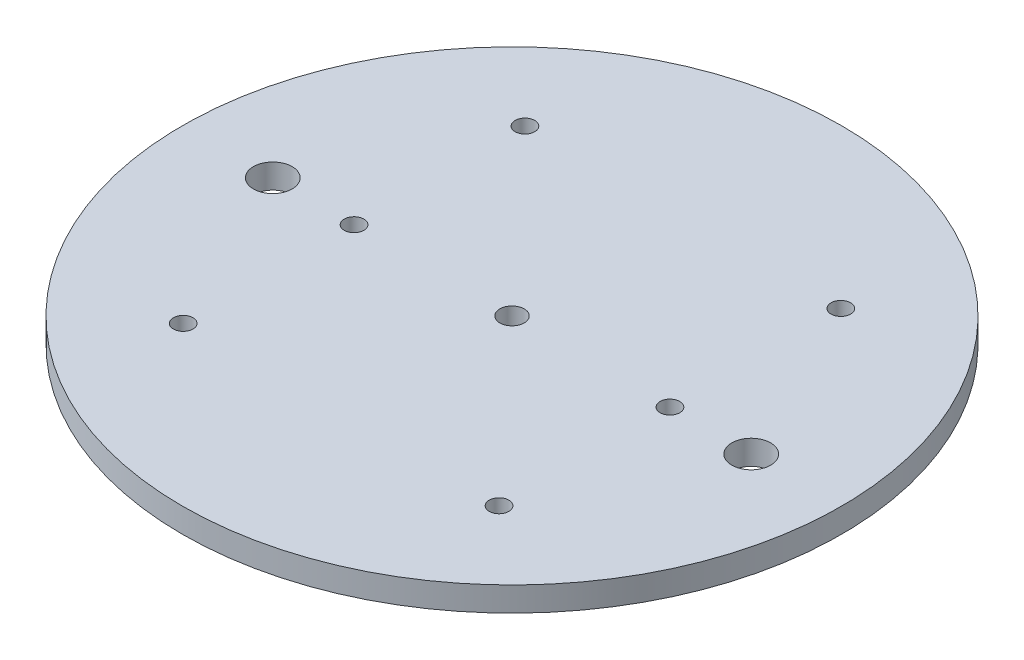
ISO-10303-21;
HEADER;
FILE_DESCRIPTION(('STEP AP214'),'2;1');
FILE_NAME('part.step','',(''),(''),'','','');
FILE_SCHEMA(('AUTOMOTIVE_DESIGN { 1 0 10303 214 1 1 1 1 }'));
ENDSEC;
DATA;
#1=APPLICATION_CONTEXT('core data for automotive mechanical design processes');
#2=APPLICATION_PROTOCOL_DEFINITION('international standard','automotive_design',2000,#1);
#3=PRODUCT_CONTEXT('',#1,'mechanical');
#4=PRODUCT('Part','Part','',(#3));
#5=PRODUCT_RELATED_PRODUCT_CATEGORY('part','',(#4));
#6=PRODUCT_DEFINITION_FORMATION('','',#4);
#7=PRODUCT_DEFINITION_CONTEXT('part definition',#1,'design');
#8=PRODUCT_DEFINITION('design','',#6,#7);
#9=PRODUCT_DEFINITION_SHAPE('','',#8);
#10=(LENGTH_UNIT() NAMED_UNIT(*) SI_UNIT(.MILLI.,.METRE.));
#11=(NAMED_UNIT(*) PLANE_ANGLE_UNIT() SI_UNIT($,.RADIAN.));
#12=(NAMED_UNIT(*) SI_UNIT($,.STERADIAN.) SOLID_ANGLE_UNIT());
#13=UNCERTAINTY_MEASURE_WITH_UNIT(LENGTH_MEASURE(1.E-05),#10,'distance_accuracy_value','');
#14=(GEOMETRIC_REPRESENTATION_CONTEXT(3) GLOBAL_UNCERTAINTY_ASSIGNED_CONTEXT((#13)) GLOBAL_UNIT_ASSIGNED_CONTEXT((#10,
#11,#12)) REPRESENTATION_CONTEXT('',''));
#15=CARTESIAN_POINT('',(0.,0.,0.));
#16=DIRECTION('',(0.,0.,1.));
#17=DIRECTION('',(1.,0.,0.));
#18=AXIS2_PLACEMENT_3D('',#15,#16,#17);
#19=CARTESIAN_POINT('',(0.,0.,0.));
#20=DIRECTION('',(0.,1.,0.));
#21=DIRECTION('',(0.,0.,1.));
#22=AXIS2_PLACEMENT_3D('',#19,#20,#21);
#23=PLANE('',#22);
#24=CARTESIAN_POINT('',(41.0845,1.1476392716558E-13,0.));
#25=DIRECTION('',(0.,-1.,0.));
#26=DIRECTION('',(0.,0.,-1.));
#27=AXIS2_PLACEMENT_3D('',#24,#25,#26);
#28=CIRCLE('',#27,2.5527);
#29=CARTESIAN_POINT('',(41.0845,1.1476392716558E-13,-2.55270000000005));
#30=VERTEX_POINT('',#29);
#31=EDGE_CURVE('E96',#30,#30,#28,.T.);
#32=ORIENTED_EDGE('',*,*,#31,.F.);
#33=EDGE_LOOP('',(#32));
#34=FACE_BOUND('',#33,.T.);
#35=CARTESIAN_POINT('',(41.0845,1.1476392716558E-13,-44.45));
#36=DIRECTION('',(0.,-1.,0.));
#37=DIRECTION('',(0.,0.,-1.));
#38=AXIS2_PLACEMENT_3D('',#35,#36,#37);
#39=CIRCLE('',#38,2.5527);
#40=CARTESIAN_POINT('',(41.0845,1.1476392716558E-13,-47.0027));
#41=VERTEX_POINT('',#40);
#42=EDGE_CURVE('E90',#41,#41,#39,.T.);
#43=ORIENTED_EDGE('',*,*,#42,.F.);
#44=EDGE_LOOP('',(#43));
#45=FACE_BOUND('',#44,.T.);
#46=CARTESIAN_POINT('',(-41.0845,1.1476392716558E-13,44.45));
#47=DIRECTION('',(0.,-1.,0.));
#48=DIRECTION('',(0.,0.,-1.));
#49=AXIS2_PLACEMENT_3D('',#46,#47,#48);
#50=CIRCLE('',#49,2.5527);
#51=CARTESIAN_POINT('',(-41.0845,1.1476392716558E-13,41.8973));
#52=VERTEX_POINT('',#51);
#53=EDGE_CURVE('E72',#52,#52,#50,.T.);
#54=ORIENTED_EDGE('',*,*,#53,.F.);
#55=EDGE_LOOP('',(#54));
#56=FACE_BOUND('',#55,.T.);
#57=CARTESIAN_POINT('',(41.0845,1.1476392716558E-13,44.45));
#58=DIRECTION('',(0.,-1.,0.));
#59=DIRECTION('',(0.,0.,-1.));
#60=AXIS2_PLACEMENT_3D('',#57,#58,#59);
#61=CIRCLE('',#60,2.5527);
#62=CARTESIAN_POINT('',(41.0845,1.1476392716558E-13,41.8973));
#63=VERTEX_POINT('',#62);
#64=EDGE_CURVE('E66',#63,#63,#61,.T.);
#65=ORIENTED_EDGE('',*,*,#64,.F.);
#66=EDGE_LOOP('',(#65));
#67=FACE_BOUND('',#66,.T.);
#68=CARTESIAN_POINT('',(0.,0.,0.));
#69=DIRECTION('',(0.,1.,0.));
#70=DIRECTION('',(0.,0.,1.));
#71=AXIS2_PLACEMENT_3D('',#68,#69,#70);
#72=CIRCLE('',#71,3.17499999999999);
#73=CARTESIAN_POINT('',(0.,0.,3.17499999999999));
#74=VERTEX_POINT('',#73);
#75=EDGE_CURVE('E57',#74,#74,#72,.T.);
#76=ORIENTED_EDGE('',*,*,#75,.T.);
#77=EDGE_LOOP('',(#76));
#78=FACE_BOUND('',#77,.T.);
#79=CARTESIAN_POINT('',(-62.23,0.,0.));
#80=DIRECTION('',(0.,1.,0.));
#81=DIRECTION('',(0.,0.,1.));
#82=AXIS2_PLACEMENT_3D('',#79,#80,#81);
#83=CIRCLE('',#82,5.04189999999999);
#84=CARTESIAN_POINT('',(-62.23,0.,5.04189999999998));
#85=VERTEX_POINT('',#84);
#86=EDGE_CURVE('E51',#85,#85,#83,.T.);
#87=ORIENTED_EDGE('',*,*,#86,.T.);
#88=EDGE_LOOP('',(#87));
#89=FACE_BOUND('',#88,.T.);
#90=CARTESIAN_POINT('',(62.23,0.,0.));
#91=DIRECTION('',(0.,1.,0.));
#92=DIRECTION('',(0.,0.,1.));
#93=AXIS2_PLACEMENT_3D('',#90,#91,#92);
#94=CIRCLE('',#93,5.04189999999999);
#95=CARTESIAN_POINT('',(62.23,0.,5.0419));
#96=VERTEX_POINT('',#95);
#97=EDGE_CURVE('E44',#96,#96,#94,.T.);
#98=ORIENTED_EDGE('',*,*,#97,.T.);
#99=EDGE_LOOP('',(#98));
#100=FACE_BOUND('',#99,.T.);
#101=CARTESIAN_POINT('',(0.,0.,0.));
#102=DIRECTION('',(0.,1.,0.));
#103=DIRECTION('',(0.,0.,1.));
#104=AXIS2_PLACEMENT_3D('',#101,#102,#103);
#105=CIRCLE('',#104,85.725);
#106=CARTESIAN_POINT('',(0.,0.,85.725));
#107=VERTEX_POINT('',#106);
#108=EDGE_CURVE('E37',#107,#107,#105,.T.);
#109=ORIENTED_EDGE('',*,*,#108,.F.);
#110=EDGE_LOOP('',(#109));
#111=FACE_BOUND('',#110,.T.);
#112=CARTESIAN_POINT('',(-41.0845,1.1476392716558E-13,0.));
#113=DIRECTION('',(0.,-1.,0.));
#114=DIRECTION('',(0.,0.,-1.));
#115=AXIS2_PLACEMENT_3D('',#112,#113,#114);
#116=CIRCLE('',#115,2.5527);
#117=CARTESIAN_POINT('',(-41.0845,1.1476392716558E-13,-2.55270000000005));
#118=VERTEX_POINT('',#117);
#119=EDGE_CURVE('E78',#118,#118,#116,.T.);
#120=ORIENTED_EDGE('',*,*,#119,.F.);
#121=EDGE_LOOP('',(#120));
#122=FACE_BOUND('',#121,.T.);
#123=CARTESIAN_POINT('',(-41.0845,1.1476392716558E-13,-44.45));
#124=DIRECTION('',(0.,-1.,0.));
#125=DIRECTION('',(0.,0.,-1.));
#126=AXIS2_PLACEMENT_3D('',#123,#124,#125);
#127=CIRCLE('',#126,2.5527);
#128=CARTESIAN_POINT('',(-41.0845,1.1476392716558E-13,-47.0027));
#129=VERTEX_POINT('',#128);
#130=EDGE_CURVE('E84',#129,#129,#127,.T.);
#131=ORIENTED_EDGE('',*,*,#130,.F.);
#132=EDGE_LOOP('',(#131));
#133=FACE_BOUND('',#132,.T.);
#134=ADVANCED_FACE('F33',(#34,#45,#56,#67,#78,#89,#100,#111,#122,#133),#23,.F.);
#135=CARTESIAN_POINT('',(0.,6.35,0.));
#136=DIRECTION('',(0.,-1.,0.));
#137=DIRECTION('',(0.,0.,-1.));
#138=AXIS2_PLACEMENT_3D('',#135,#136,#137);
#139=CYLINDRICAL_SURFACE('',#138,85.725);
#140=CARTESIAN_POINT('',(0.,6.35,0.));
#141=DIRECTION('',(0.,1.,0.));
#142=DIRECTION('',(0.,0.,1.));
#143=AXIS2_PLACEMENT_3D('',#140,#141,#142);
#144=CIRCLE('',#143,85.725);
#145=CARTESIAN_POINT('',(0.,6.35,85.725));
#146=VERTEX_POINT('',#145);
#147=EDGE_CURVE('E10',#146,#146,#144,.T.);
#148=ORIENTED_EDGE('',*,*,#147,.F.);
#149=EDGE_LOOP('',(#148));
#150=FACE_BOUND('',#149,.T.);
#151=ORIENTED_EDGE('',*,*,#108,.T.);
#152=EDGE_LOOP('',(#151));
#153=FACE_BOUND('',#152,.T.);
#154=ADVANCED_FACE('F35',(#150,#153),#139,.T.);
#155=CARTESIAN_POINT('',(0.,6.35,0.));
#156=DIRECTION('',(0.,1.,0.));
#157=DIRECTION('',(0.,0.,1.));
#158=AXIS2_PLACEMENT_3D('',#155,#156,#157);
#159=PLANE('',#158);
#160=CARTESIAN_POINT('',(41.0845,6.35,0.));
#161=DIRECTION('',(0.,1.,0.));
#162=DIRECTION('',(0.,0.,1.));
#163=AXIS2_PLACEMENT_3D('',#160,#161,#162);
#164=CIRCLE('',#163,2.5527);
#165=CARTESIAN_POINT('',(41.0845,6.35,2.55269999999994));
#166=VERTEX_POINT('',#165);
#167=EDGE_CURVE('E93',#166,#166,#164,.T.);
#168=ORIENTED_EDGE('',*,*,#167,.F.);
#169=EDGE_LOOP('',(#168));
#170=FACE_BOUND('',#169,.T.);
#171=CARTESIAN_POINT('',(41.0845,6.35,-44.45));
#172=DIRECTION('',(0.,1.,0.));
#173=DIRECTION('',(0.,0.,1.));
#174=AXIS2_PLACEMENT_3D('',#171,#172,#173);
#175=CIRCLE('',#174,2.5527);
#176=CARTESIAN_POINT('',(41.0845,6.35,-41.8973));
#177=VERTEX_POINT('',#176);
#178=EDGE_CURVE('E87',#177,#177,#175,.T.);
#179=ORIENTED_EDGE('',*,*,#178,.F.);
#180=EDGE_LOOP('',(#179));
#181=FACE_BOUND('',#180,.T.);
#182=CARTESIAN_POINT('',(-41.0845,6.35,-44.45));
#183=DIRECTION('',(0.,1.,0.));
#184=DIRECTION('',(0.,0.,1.));
#185=AXIS2_PLACEMENT_3D('',#182,#183,#184);
#186=CIRCLE('',#185,2.5527);
#187=CARTESIAN_POINT('',(-41.0845,6.35,-41.8973));
#188=VERTEX_POINT('',#187);
#189=EDGE_CURVE('E81',#188,#188,#186,.T.);
#190=ORIENTED_EDGE('',*,*,#189,.F.);
#191=EDGE_LOOP('',(#190));
#192=FACE_BOUND('',#191,.T.);
#193=CARTESIAN_POINT('',(-41.0845,6.35,0.));
#194=DIRECTION('',(0.,1.,0.));
#195=DIRECTION('',(0.,0.,1.));
#196=AXIS2_PLACEMENT_3D('',#193,#194,#195);
#197=CIRCLE('',#196,2.5527);
#198=CARTESIAN_POINT('',(-41.0845,6.35,2.55269999999994));
#199=VERTEX_POINT('',#198);
#200=EDGE_CURVE('E75',#199,#199,#197,.T.);
#201=ORIENTED_EDGE('',*,*,#200,.F.);
#202=EDGE_LOOP('',(#201));
#203=FACE_BOUND('',#202,.T.);
#204=CARTESIAN_POINT('',(-41.0845,6.35,44.45));
#205=DIRECTION('',(0.,1.,0.));
#206=DIRECTION('',(0.,0.,1.));
#207=AXIS2_PLACEMENT_3D('',#204,#205,#206);
#208=CIRCLE('',#207,2.5527);
#209=CARTESIAN_POINT('',(-41.0845,6.35,47.0027));
#210=VERTEX_POINT('',#209);
#211=EDGE_CURVE('E69',#210,#210,#208,.T.);
#212=ORIENTED_EDGE('',*,*,#211,.F.);
#213=EDGE_LOOP('',(#212));
#214=FACE_BOUND('',#213,.T.);
#215=CARTESIAN_POINT('',(41.0845,6.35,44.45));
#216=DIRECTION('',(0.,1.,0.));
#217=DIRECTION('',(0.,0.,1.));
#218=AXIS2_PLACEMENT_3D('',#215,#216,#217);
#219=CIRCLE('',#218,2.5527);
#220=CARTESIAN_POINT('',(41.0845,6.35,47.0027));
#221=VERTEX_POINT('',#220);
#222=EDGE_CURVE('E63',#221,#221,#219,.T.);
#223=ORIENTED_EDGE('',*,*,#222,.F.);
#224=EDGE_LOOP('',(#223));
#225=FACE_BOUND('',#224,.T.);
#226=CARTESIAN_POINT('',(0.,6.35000000000012,0.));
#227=DIRECTION('',(0.,1.,0.));
#228=DIRECTION('',(0.,0.,1.));
#229=AXIS2_PLACEMENT_3D('',#226,#227,#228);
#230=CIRCLE('',#229,3.17499999999999);
#231=CARTESIAN_POINT('',(0.,6.35000000000012,3.17499999999999));
#232=VERTEX_POINT('',#231);
#233=EDGE_CURVE('E60',#232,#232,#230,.T.);
#234=ORIENTED_EDGE('',*,*,#233,.F.);
#235=EDGE_LOOP('',(#234));
#236=FACE_BOUND('',#235,.T.);
#237=CARTESIAN_POINT('',(-62.23,6.35,0.));
#238=DIRECTION('',(0.,1.,0.));
#239=DIRECTION('',(0.,0.,1.));
#240=AXIS2_PLACEMENT_3D('',#237,#238,#239);
#241=CIRCLE('',#240,5.04189999999999);
#242=CARTESIAN_POINT('',(-62.23,6.35,5.04189999999998));
#243=VERTEX_POINT('',#242);
#244=EDGE_CURVE('E54',#243,#243,#241,.T.);
#245=ORIENTED_EDGE('',*,*,#244,.F.);
#246=EDGE_LOOP('',(#245));
#247=FACE_BOUND('',#246,.T.);
#248=CARTESIAN_POINT('',(62.23,6.35,0.));
#249=DIRECTION('',(0.,1.,0.));
#250=DIRECTION('',(0.,0.,1.));
#251=AXIS2_PLACEMENT_3D('',#248,#249,#250);
#252=CIRCLE('',#251,5.04189999999999);
#253=CARTESIAN_POINT('',(62.23,6.35,5.0419));
#254=VERTEX_POINT('',#253);
#255=EDGE_CURVE('E48',#254,#254,#252,.T.);
#256=ORIENTED_EDGE('',*,*,#255,.F.);
#257=EDGE_LOOP('',(#256));
#258=FACE_BOUND('',#257,.T.);
#259=ORIENTED_EDGE('',*,*,#147,.T.);
#260=EDGE_LOOP('',(#259));
#261=FACE_BOUND('',#260,.T.);
#262=ADVANCED_FACE('F131',(#170,#181,#192,#203,#214,#225,#236,#247,#258,#261),#159,.T.);
#263=CARTESIAN_POINT('',(62.23,6.35,0.));
#264=DIRECTION('',(0.,1.,0.));
#265=DIRECTION('',(0.,0.,1.));
#266=AXIS2_PLACEMENT_3D('',#263,#264,#265);
#267=CYLINDRICAL_SURFACE('',#266,5.04189999999999);
#268=ORIENTED_EDGE('',*,*,#97,.F.);
#269=EDGE_LOOP('',(#268));
#270=FACE_BOUND('',#269,.T.);
#271=ORIENTED_EDGE('',*,*,#255,.T.);
#272=EDGE_LOOP('',(#271));
#273=FACE_BOUND('',#272,.T.);
#274=ADVANCED_FACE('F134',(#270,#273),#267,.F.);
#275=CARTESIAN_POINT('',(-62.23,6.35,0.));
#276=DIRECTION('',(0.,1.,0.));
#277=DIRECTION('',(0.,0.,1.));
#278=AXIS2_PLACEMENT_3D('',#275,#276,#277);
#279=CYLINDRICAL_SURFACE('',#278,5.04189999999999);
#280=ORIENTED_EDGE('',*,*,#86,.F.);
#281=EDGE_LOOP('',(#280));
#282=FACE_BOUND('',#281,.T.);
#283=ORIENTED_EDGE('',*,*,#244,.T.);
#284=EDGE_LOOP('',(#283));
#285=FACE_BOUND('',#284,.T.);
#286=ADVANCED_FACE('F150',(#282,#285),#279,.F.);
#287=CARTESIAN_POINT('',(0.,6.35000000000012,0.));
#288=DIRECTION('',(0.,1.,0.));
#289=DIRECTION('',(0.,0.,1.));
#290=AXIS2_PLACEMENT_3D('',#287,#288,#289);
#291=CYLINDRICAL_SURFACE('',#290,3.17499999999999);
#292=ORIENTED_EDGE('',*,*,#75,.F.);
#293=EDGE_LOOP('',(#292));
#294=FACE_BOUND('',#293,.T.);
#295=ORIENTED_EDGE('',*,*,#233,.T.);
#296=EDGE_LOOP('',(#295));
#297=FACE_BOUND('',#296,.T.);
#298=ADVANCED_FACE('F156',(#294,#297),#291,.F.);
#299=CARTESIAN_POINT('',(41.0845,1.14491749414469E-13,44.45));
#300=DIRECTION('',(0.,-1.,0.));
#301=DIRECTION('',(0.,0.,-1.));
#302=AXIS2_PLACEMENT_3D('',#299,#300,#301);
#303=CYLINDRICAL_SURFACE('',#302,2.5527);
#304=ORIENTED_EDGE('',*,*,#64,.T.);
#305=EDGE_LOOP('',(#304));
#306=FACE_BOUND('',#305,.T.);
#307=ORIENTED_EDGE('',*,*,#222,.T.);
#308=EDGE_LOOP('',(#307));
#309=FACE_BOUND('',#308,.T.);
#310=ADVANCED_FACE('F162',(#306,#309),#303,.F.);
#311=CARTESIAN_POINT('',(-41.0845,1.14491749414469E-13,44.45));
#312=DIRECTION('',(0.,-1.,0.));
#313=DIRECTION('',(0.,0.,-1.));
#314=AXIS2_PLACEMENT_3D('',#311,#312,#313);
#315=CYLINDRICAL_SURFACE('',#314,2.5527);
#316=ORIENTED_EDGE('',*,*,#53,.T.);
#317=EDGE_LOOP('',(#316));
#318=FACE_BOUND('',#317,.T.);
#319=ORIENTED_EDGE('',*,*,#211,.T.);
#320=EDGE_LOOP('',(#319));
#321=FACE_BOUND('',#320,.T.);
#322=ADVANCED_FACE('F166',(#318,#321),#315,.F.);
#323=CARTESIAN_POINT('',(-41.0845,1.14491749414469E-13,0.));
#324=DIRECTION('',(0.,-1.,0.));
#325=DIRECTION('',(0.,0.,-1.));
#326=AXIS2_PLACEMENT_3D('',#323,#324,#325);
#327=CYLINDRICAL_SURFACE('',#326,2.5527);
#328=ORIENTED_EDGE('',*,*,#119,.T.);
#329=EDGE_LOOP('',(#328));
#330=FACE_BOUND('',#329,.T.);
#331=ORIENTED_EDGE('',*,*,#200,.T.);
#332=EDGE_LOOP('',(#331));
#333=FACE_BOUND('',#332,.T.);
#334=ADVANCED_FACE('F127',(#330,#333),#327,.F.);
#335=CARTESIAN_POINT('',(-41.0845,1.14491749414469E-13,-44.45));
#336=DIRECTION('',(0.,-1.,0.));
#337=DIRECTION('',(0.,0.,-1.));
#338=AXIS2_PLACEMENT_3D('',#335,#336,#337);
#339=CYLINDRICAL_SURFACE('',#338,2.5527);
#340=ORIENTED_EDGE('',*,*,#130,.T.);
#341=EDGE_LOOP('',(#340));
#342=FACE_BOUND('',#341,.T.);
#343=ORIENTED_EDGE('',*,*,#189,.T.);
#344=EDGE_LOOP('',(#343));
#345=FACE_BOUND('',#344,.T.);
#346=ADVANCED_FACE('F123',(#342,#345),#339,.F.);
#347=CARTESIAN_POINT('',(41.0845,1.14491749414469E-13,-44.45));
#348=DIRECTION('',(0.,-1.,0.));
#349=DIRECTION('',(0.,0.,-1.));
#350=AXIS2_PLACEMENT_3D('',#347,#348,#349);
#351=CYLINDRICAL_SURFACE('',#350,2.5527);
#352=ORIENTED_EDGE('',*,*,#42,.T.);
#353=EDGE_LOOP('',(#352));
#354=FACE_BOUND('',#353,.T.);
#355=ORIENTED_EDGE('',*,*,#178,.T.);
#356=EDGE_LOOP('',(#355));
#357=FACE_BOUND('',#356,.T.);
#358=ADVANCED_FACE('F126',(#354,#357),#351,.F.);
#359=CARTESIAN_POINT('',(41.0845,1.14491749414469E-13,0.));
#360=DIRECTION('',(0.,-1.,0.));
#361=DIRECTION('',(0.,0.,-1.));
#362=AXIS2_PLACEMENT_3D('',#359,#360,#361);
#363=CYLINDRICAL_SURFACE('',#362,2.5527);
#364=ORIENTED_EDGE('',*,*,#31,.T.);
#365=EDGE_LOOP('',(#364));
#366=FACE_BOUND('',#365,.T.);
#367=ORIENTED_EDGE('',*,*,#167,.T.);
#368=EDGE_LOOP('',(#367));
#369=FACE_BOUND('',#368,.T.);
#370=ADVANCED_FACE('F100',(#366,#369),#363,.F.);
#371=CLOSED_SHELL('',(#134,#154,#262,#274,#286,#298,#310,#322,#334,#346,#358,#370));
#372=MANIFOLD_SOLID_BREP('B2',#371);
#373=ADVANCED_BREP_SHAPE_REPRESENTATION('',(#18,#372),#14);
#374=SHAPE_DEFINITION_REPRESENTATION(#9,#373);
ENDSEC;
END-ISO-10303-21;
